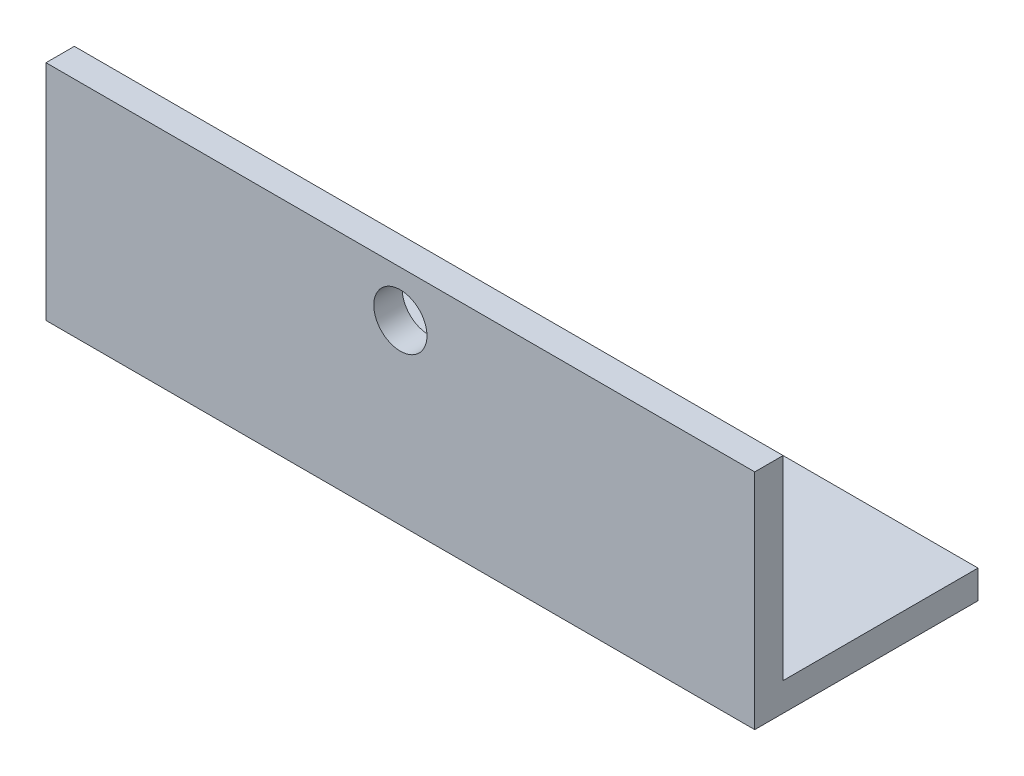
ISO-10303-21;
HEADER;
FILE_DESCRIPTION(('STEP AP214'),'2;1');
FILE_NAME('part.step','',(''),(''),'','','');
FILE_SCHEMA(('AUTOMOTIVE_DESIGN { 1 0 10303 214 1 1 1 1 }'));
ENDSEC;
DATA;
#1=APPLICATION_CONTEXT('core data for automotive mechanical design processes');
#2=APPLICATION_PROTOCOL_DEFINITION('international standard','automotive_design',2000,#1);
#3=PRODUCT_CONTEXT('',#1,'mechanical');
#4=PRODUCT('Part','Part','',(#3));
#5=PRODUCT_RELATED_PRODUCT_CATEGORY('part','',(#4));
#6=PRODUCT_DEFINITION_FORMATION('','',#4);
#7=PRODUCT_DEFINITION_CONTEXT('part definition',#1,'design');
#8=PRODUCT_DEFINITION('design','',#6,#7);
#9=PRODUCT_DEFINITION_SHAPE('','',#8);
#10=(LENGTH_UNIT() NAMED_UNIT(*) SI_UNIT(.MILLI.,.METRE.));
#11=(NAMED_UNIT(*) PLANE_ANGLE_UNIT() SI_UNIT($,.RADIAN.));
#12=(NAMED_UNIT(*) SI_UNIT($,.STERADIAN.) SOLID_ANGLE_UNIT());
#13=UNCERTAINTY_MEASURE_WITH_UNIT(LENGTH_MEASURE(1.E-05),#10,'distance_accuracy_value','');
#14=(GEOMETRIC_REPRESENTATION_CONTEXT(3) GLOBAL_UNCERTAINTY_ASSIGNED_CONTEXT((#13)) GLOBAL_UNIT_ASSIGNED_CONTEXT((#10,
#11,#12)) REPRESENTATION_CONTEXT('',''));
#15=CARTESIAN_POINT('',(0.,0.,0.));
#16=DIRECTION('',(0.,0.,1.));
#17=DIRECTION('',(1.,0.,0.));
#18=AXIS2_PLACEMENT_3D('',#15,#16,#17);
#19=CARTESIAN_POINT('',(20.,1.6,0.));
#20=DIRECTION('',(1.,0.,0.));
#21=DIRECTION('',(0.,0.,-1.));
#22=AXIS2_PLACEMENT_3D('',#19,#20,#21);
#23=PLANE('',#22);
#24=DIRECTION('',(0.,0.,1.));
#25=VECTOR('',#24,1.);
#26=CARTESIAN_POINT('',(20.,0.,0.));
#27=LINE('',#26,#25);
#28=CARTESIAN_POINT('',(20.,0.,-12.6));
#29=VERTEX_POINT('',#28);
#30=CARTESIAN_POINT('',(20.,0.,0.));
#31=VERTEX_POINT('',#30);
#32=EDGE_CURVE('E88',#29,#31,#27,.T.);
#33=ORIENTED_EDGE('',*,*,#32,.F.);
#34=DIRECTION('',(0.,-1.,0.));
#35=VECTOR('',#34,1.);
#36=CARTESIAN_POINT('',(20.,1.6,-12.6));
#37=LINE('',#36,#35);
#38=CARTESIAN_POINT('',(20.,1.6,-12.6));
#39=VERTEX_POINT('',#38);
#40=EDGE_CURVE('E11',#39,#29,#37,.T.);
#41=ORIENTED_EDGE('',*,*,#40,.F.);
#42=DIRECTION('',(0.,0.,1.));
#43=VECTOR('',#42,1.);
#44=CARTESIAN_POINT('',(20.,1.6,0.));
#45=LINE('',#44,#43);
#46=CARTESIAN_POINT('',(20.,1.6,-1.6));
#47=VERTEX_POINT('',#46);
#48=EDGE_CURVE('E142',#39,#47,#45,.T.);
#49=ORIENTED_EDGE('',*,*,#48,.T.);
#50=DIRECTION('',(0.,-1.,0.));
#51=VECTOR('',#50,1.);
#52=CARTESIAN_POINT('',(20.,12.6,-1.6));
#53=LINE('',#52,#51);
#54=CARTESIAN_POINT('',(20.,12.6,-1.6));
#55=VERTEX_POINT('',#54);
#56=EDGE_CURVE('E122',#55,#47,#53,.T.);
#57=ORIENTED_EDGE('',*,*,#56,.F.);
#58=DIRECTION('',(0.,0.,-1.));
#59=VECTOR('',#58,1.);
#60=CARTESIAN_POINT('',(20.,12.6,0.));
#61=LINE('',#60,#59);
#62=CARTESIAN_POINT('',(20.,12.6,0.));
#63=VERTEX_POINT('',#62);
#64=EDGE_CURVE('E93',#63,#55,#61,.T.);
#65=ORIENTED_EDGE('',*,*,#64,.F.);
#66=DIRECTION('',(0.,-1.,0.));
#67=VECTOR('',#66,1.);
#68=CARTESIAN_POINT('',(20.,1.6,0.));
#69=LINE('',#68,#67);
#70=EDGE_CURVE('E85',#63,#31,#69,.T.);
#71=ORIENTED_EDGE('',*,*,#70,.T.);
#72=EDGE_LOOP('',(#33,#41,#49,#57,#65,#71));
#73=FACE_BOUND('',#72,.T.);
#74=ADVANCED_FACE('F41',(#73),#23,.T.);
#75=CARTESIAN_POINT('',(0.,1.6,-12.6));
#76=DIRECTION('',(0.,0.,-1.));
#77=DIRECTION('',(-1.,0.,0.));
#78=AXIS2_PLACEMENT_3D('',#75,#76,#77);
#79=PLANE('',#78);
#80=DIRECTION('',(1.,0.,0.));
#81=VECTOR('',#80,1.);
#82=CARTESIAN_POINT('',(0.,0.,-12.6));
#83=LINE('',#82,#81);
#84=CARTESIAN_POINT('',(-20.,0.,-12.6));
#85=VERTEX_POINT('',#84);
#86=EDGE_CURVE('E114',#85,#29,#83,.T.);
#87=ORIENTED_EDGE('',*,*,#86,.F.);
#88=DIRECTION('',(0.,-1.,0.));
#89=VECTOR('',#88,1.);
#90=CARTESIAN_POINT('',(-20.,1.6,-12.6));
#91=LINE('',#90,#89);
#92=CARTESIAN_POINT('',(-20.,1.6,-12.6));
#93=VERTEX_POINT('',#92);
#94=EDGE_CURVE('E51',#93,#85,#91,.T.);
#95=ORIENTED_EDGE('',*,*,#94,.F.);
#96=DIRECTION('',(1.,0.,0.));
#97=VECTOR('',#96,1.);
#98=CARTESIAN_POINT('',(0.,1.6,-12.6));
#99=LINE('',#98,#97);
#100=EDGE_CURVE('E141',#93,#39,#99,.T.);
#101=ORIENTED_EDGE('',*,*,#100,.T.);
#102=ORIENTED_EDGE('',*,*,#40,.T.);
#103=EDGE_LOOP('',(#87,#95,#101,#102));
#104=FACE_BOUND('',#103,.T.);
#105=ADVANCED_FACE('F140',(#104),#79,.T.);
#106=CARTESIAN_POINT('',(-20.,1.6,0.));
#107=DIRECTION('',(1.,0.,0.));
#108=DIRECTION('',(0.,0.,-1.));
#109=AXIS2_PLACEMENT_3D('',#106,#107,#108);
#110=PLANE('',#109);
#111=DIRECTION('',(0.,0.,1.));
#112=VECTOR('',#111,1.);
#113=CARTESIAN_POINT('',(-20.,0.,0.));
#114=LINE('',#113,#112);
#115=CARTESIAN_POINT('',(-20.,0.,0.));
#116=VERTEX_POINT('',#115);
#117=EDGE_CURVE('E110',#85,#116,#114,.T.);
#118=ORIENTED_EDGE('',*,*,#117,.T.);
#119=DIRECTION('',(0.,-1.,0.));
#120=VECTOR('',#119,1.);
#121=CARTESIAN_POINT('',(-20.,1.6,0.));
#122=LINE('',#121,#120);
#123=CARTESIAN_POINT('',(-20.,12.6,0.));
#124=VERTEX_POINT('',#123);
#125=EDGE_CURVE('E98',#124,#116,#122,.T.);
#126=ORIENTED_EDGE('',*,*,#125,.F.);
#127=DIRECTION('',(0.,0.,1.));
#128=VECTOR('',#127,1.);
#129=CARTESIAN_POINT('',(-20.,12.6,0.));
#130=LINE('',#129,#128);
#131=CARTESIAN_POINT('',(-20.,12.6,-1.6));
#132=VERTEX_POINT('',#131);
#133=EDGE_CURVE('E197',#132,#124,#130,.T.);
#134=ORIENTED_EDGE('',*,*,#133,.F.);
#135=DIRECTION('',(0.,-1.,0.));
#136=VECTOR('',#135,1.);
#137=CARTESIAN_POINT('',(-20.,12.6,-1.6));
#138=LINE('',#137,#136);
#139=CARTESIAN_POINT('',(-20.,1.6,-1.6));
#140=VERTEX_POINT('',#139);
#141=EDGE_CURVE('E210',#132,#140,#138,.T.);
#142=ORIENTED_EDGE('',*,*,#141,.T.);
#143=DIRECTION('',(0.,0.,1.));
#144=VECTOR('',#143,1.);
#145=CARTESIAN_POINT('',(-20.,1.6,0.));
#146=LINE('',#145,#144);
#147=EDGE_CURVE('E138',#93,#140,#146,.T.);
#148=ORIENTED_EDGE('',*,*,#147,.F.);
#149=ORIENTED_EDGE('',*,*,#94,.T.);
#150=EDGE_LOOP('',(#118,#126,#134,#142,#148,#149));
#151=FACE_BOUND('',#150,.T.);
#152=ADVANCED_FACE('F136',(#151),#110,.F.);
#153=CARTESIAN_POINT('',(0.,1.6,0.));
#154=DIRECTION('',(0.,0.,-1.));
#155=DIRECTION('',(-1.,0.,0.));
#156=AXIS2_PLACEMENT_3D('',#153,#154,#155);
#157=PLANE('',#156);
#158=CARTESIAN_POINT('',(0.,10.,0.));
#159=DIRECTION('',(0.,0.,1.));
#160=DIRECTION('',(1.,0.,0.));
#161=AXIS2_PLACEMENT_3D('',#158,#159,#160);
#162=CIRCLE('',#161,1.5);
#163=CARTESIAN_POINT('',(1.5,10.,0.));
#164=VERTEX_POINT('',#163);
#165=EDGE_CURVE('E190',#164,#164,#162,.T.);
#166=ORIENTED_EDGE('',*,*,#165,.F.);
#167=EDGE_LOOP('',(#166));
#168=FACE_BOUND('',#167,.T.);
#169=DIRECTION('',(1.,0.,0.));
#170=VECTOR('',#169,1.);
#171=CARTESIAN_POINT('',(0.,0.,0.));
#172=LINE('',#171,#170);
#173=EDGE_CURVE('E102',#116,#31,#172,.T.);
#174=ORIENTED_EDGE('',*,*,#173,.T.);
#175=ORIENTED_EDGE('',*,*,#70,.F.);
#176=DIRECTION('',(1.,0.,0.));
#177=VECTOR('',#176,1.);
#178=CARTESIAN_POINT('',(-20.,12.6,0.));
#179=LINE('',#178,#177);
#180=EDGE_CURVE('E201',#124,#63,#179,.T.);
#181=ORIENTED_EDGE('',*,*,#180,.F.);
#182=ORIENTED_EDGE('',*,*,#125,.T.);
#183=EDGE_LOOP('',(#174,#175,#181,#182));
#184=FACE_BOUND('',#183,.T.);
#185=ADVANCED_FACE('F103',(#168,#184),#157,.F.);
#186=CARTESIAN_POINT('',(12.5,1.6,-6.30000000000001));
#187=DIRECTION('',(0.,-1.,0.));
#188=DIRECTION('',(0.,0.,-1.));
#189=AXIS2_PLACEMENT_3D('',#186,#187,#188);
#190=CYLINDRICAL_SURFACE('',#189,1.5);
#191=CARTESIAN_POINT('',(12.5,1.6,-6.30000000000001));
#192=DIRECTION('',(0.,1.,0.));
#193=DIRECTION('',(0.,0.,1.));
#194=AXIS2_PLACEMENT_3D('',#191,#192,#193);
#195=CIRCLE('',#194,1.5);
#196=CARTESIAN_POINT('',(12.5,1.6,-4.80000000000001));
#197=VERTEX_POINT('',#196);
#198=EDGE_CURVE('E130',#197,#197,#195,.F.);
#199=ORIENTED_EDGE('',*,*,#198,.F.);
#200=EDGE_LOOP('',(#199));
#201=FACE_BOUND('',#200,.T.);
#202=CARTESIAN_POINT('',(12.5,0.,-6.30000000000001));
#203=DIRECTION('',(0.,1.,0.));
#204=DIRECTION('',(0.,0.,1.));
#205=AXIS2_PLACEMENT_3D('',#202,#203,#204);
#206=CIRCLE('',#205,1.5);
#207=CARTESIAN_POINT('',(12.5,0.,-4.80000000000001));
#208=VERTEX_POINT('',#207);
#209=EDGE_CURVE('E116',#208,#208,#206,.F.);
#210=ORIENTED_EDGE('',*,*,#209,.T.);
#211=EDGE_LOOP('',(#210));
#212=FACE_BOUND('',#211,.T.);
#213=ADVANCED_FACE('F43',(#201,#212),#190,.F.);
#214=CARTESIAN_POINT('',(-12.5,1.6,-6.30000000000001));
#215=DIRECTION('',(0.,-1.,0.));
#216=DIRECTION('',(0.,0.,-1.));
#217=AXIS2_PLACEMENT_3D('',#214,#215,#216);
#218=CYLINDRICAL_SURFACE('',#217,1.5);
#219=CARTESIAN_POINT('',(-12.5,1.6,-6.30000000000001));
#220=DIRECTION('',(0.,1.,0.));
#221=DIRECTION('',(0.,0.,1.));
#222=AXIS2_PLACEMENT_3D('',#219,#220,#221);
#223=CIRCLE('',#222,1.5);
#224=CARTESIAN_POINT('',(-12.5,1.6,-4.80000000000001));
#225=VERTEX_POINT('',#224);
#226=EDGE_CURVE('E99',#225,#225,#223,.T.);
#227=ORIENTED_EDGE('',*,*,#226,.T.);
#228=EDGE_LOOP('',(#227));
#229=FACE_BOUND('',#228,.T.);
#230=CARTESIAN_POINT('',(-12.5,0.,-6.30000000000001));
#231=DIRECTION('',(0.,1.,0.));
#232=DIRECTION('',(0.,0.,1.));
#233=AXIS2_PLACEMENT_3D('',#230,#231,#232);
#234=CIRCLE('',#233,1.5);
#235=CARTESIAN_POINT('',(-12.5,0.,-4.80000000000001));
#236=VERTEX_POINT('',#235);
#237=EDGE_CURVE('E109',#236,#236,#234,.T.);
#238=ORIENTED_EDGE('',*,*,#237,.F.);
#239=EDGE_LOOP('',(#238));
#240=FACE_BOUND('',#239,.T.);
#241=ADVANCED_FACE('F160',(#229,#240),#218,.F.);
#242=CARTESIAN_POINT('',(0.,1.6,0.));
#243=DIRECTION('',(0.,1.,0.));
#244=DIRECTION('',(0.,0.,1.));
#245=AXIS2_PLACEMENT_3D('',#242,#243,#244);
#246=PLANE('',#245);
#247=DIRECTION('',(-1.,0.,0.));
#248=VECTOR('',#247,1.);
#249=CARTESIAN_POINT('',(-20.,1.6,-1.6));
#250=LINE('',#249,#248);
#251=EDGE_CURVE('E58',#47,#140,#250,.T.);
#252=ORIENTED_EDGE('',*,*,#251,.F.);
#253=ORIENTED_EDGE('',*,*,#48,.F.);
#254=ORIENTED_EDGE('',*,*,#100,.F.);
#255=ORIENTED_EDGE('',*,*,#147,.T.);
#256=EDGE_LOOP('',(#252,#253,#254,#255));
#257=FACE_BOUND('',#256,.T.);
#258=ORIENTED_EDGE('',*,*,#198,.T.);
#259=EDGE_LOOP('',(#258));
#260=FACE_BOUND('',#259,.T.);
#261=ORIENTED_EDGE('',*,*,#226,.F.);
#262=EDGE_LOOP('',(#261));
#263=FACE_BOUND('',#262,.T.);
#264=ADVANCED_FACE('F144',(#257,#260,#263),#246,.T.);
#265=CARTESIAN_POINT('',(0.,0.,0.));
#266=DIRECTION('',(0.,1.,0.));
#267=DIRECTION('',(0.,0.,1.));
#268=AXIS2_PLACEMENT_3D('',#265,#266,#267);
#269=PLANE('',#268);
#270=ORIENTED_EDGE('',*,*,#209,.F.);
#271=EDGE_LOOP('',(#270));
#272=FACE_BOUND('',#271,.T.);
#273=ORIENTED_EDGE('',*,*,#32,.T.);
#274=ORIENTED_EDGE('',*,*,#173,.F.);
#275=ORIENTED_EDGE('',*,*,#117,.F.);
#276=ORIENTED_EDGE('',*,*,#86,.T.);
#277=EDGE_LOOP('',(#273,#274,#275,#276));
#278=FACE_BOUND('',#277,.T.);
#279=ORIENTED_EDGE('',*,*,#237,.T.);
#280=EDGE_LOOP('',(#279));
#281=FACE_BOUND('',#280,.T.);
#282=ADVANCED_FACE('F112',(#272,#278,#281),#269,.F.);
#283=CARTESIAN_POINT('',(-20.,12.6,-1.6));
#284=DIRECTION('',(0.,0.,1.));
#285=DIRECTION('',(1.,0.,0.));
#286=AXIS2_PLACEMENT_3D('',#283,#284,#285);
#287=PLANE('',#286);
#288=CARTESIAN_POINT('',(0.,10.,-1.6));
#289=DIRECTION('',(0.,0.,1.));
#290=DIRECTION('',(1.,0.,0.));
#291=AXIS2_PLACEMENT_3D('',#288,#289,#290);
#292=CIRCLE('',#291,1.5);
#293=CARTESIAN_POINT('',(1.5,10.,-1.6));
#294=VERTEX_POINT('',#293);
#295=EDGE_CURVE('E45',#294,#294,#292,.T.);
#296=ORIENTED_EDGE('',*,*,#295,.T.);
#297=EDGE_LOOP('',(#296));
#298=FACE_BOUND('',#297,.T.);
#299=ORIENTED_EDGE('',*,*,#251,.T.);
#300=ORIENTED_EDGE('',*,*,#141,.F.);
#301=DIRECTION('',(-1.,0.,0.));
#302=VECTOR('',#301,1.);
#303=CARTESIAN_POINT('',(-20.,12.6,-1.6));
#304=LINE('',#303,#302);
#305=EDGE_CURVE('E206',#55,#132,#304,.T.);
#306=ORIENTED_EDGE('',*,*,#305,.F.);
#307=ORIENTED_EDGE('',*,*,#56,.T.);
#308=EDGE_LOOP('',(#299,#300,#306,#307));
#309=FACE_BOUND('',#308,.T.);
#310=ADVANCED_FACE('F169',(#298,#309),#287,.F.);
#311=CARTESIAN_POINT('',(0.,12.6,0.));
#312=DIRECTION('',(0.,-1.,0.));
#313=DIRECTION('',(0.,0.,-1.));
#314=AXIS2_PLACEMENT_3D('',#311,#312,#313);
#315=PLANE('',#314);
#316=ORIENTED_EDGE('',*,*,#133,.T.);
#317=ORIENTED_EDGE('',*,*,#180,.T.);
#318=ORIENTED_EDGE('',*,*,#64,.T.);
#319=ORIENTED_EDGE('',*,*,#305,.T.);
#320=EDGE_LOOP('',(#316,#317,#318,#319));
#321=FACE_BOUND('',#320,.T.);
#322=ADVANCED_FACE('F227',(#321),#315,.F.);
#323=CARTESIAN_POINT('',(0.,10.,-12.6));
#324=DIRECTION('',(0.,0.,1.));
#325=DIRECTION('',(1.,0.,0.));
#326=AXIS2_PLACEMENT_3D('',#323,#324,#325);
#327=CYLINDRICAL_SURFACE('',#326,1.5);
#328=ORIENTED_EDGE('',*,*,#165,.T.);
#329=EDGE_LOOP('',(#328));
#330=FACE_BOUND('',#329,.T.);
#331=ORIENTED_EDGE('',*,*,#295,.F.);
#332=EDGE_LOOP('',(#331));
#333=FACE_BOUND('',#332,.T.);
#334=ADVANCED_FACE('F229',(#330,#333),#327,.F.);
#335=CLOSED_SHELL('',(#74,#105,#152,#185,#213,#241,#264,#282,#310,#322,#334));
#336=MANIFOLD_SOLID_BREP('B2',#335);
#337=ADVANCED_BREP_SHAPE_REPRESENTATION('',(#18,#336),#14);
#338=SHAPE_DEFINITION_REPRESENTATION(#9,#337);
ENDSEC;
END-ISO-10303-21;
